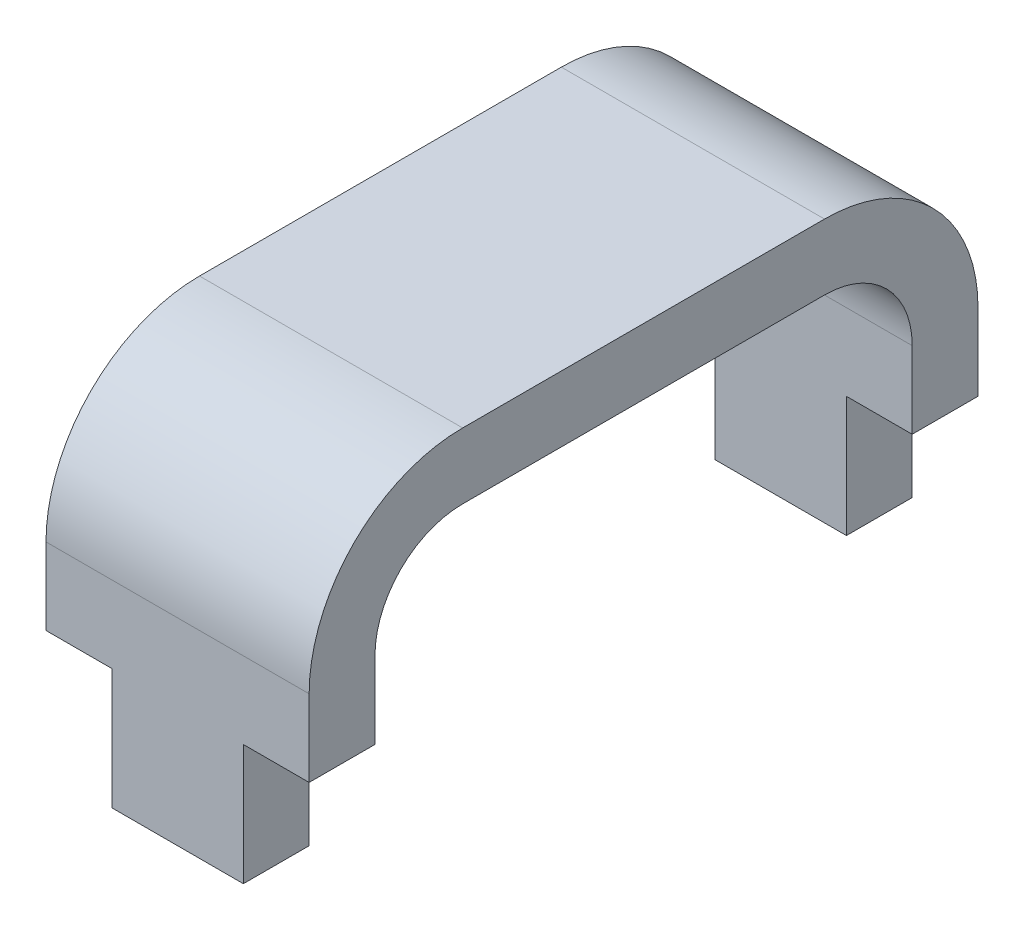
ISO-10303-21;
HEADER;
FILE_DESCRIPTION(('STEP AP214'),'2;1');
FILE_NAME('part.step','',(''),(''),'','','');
FILE_SCHEMA(('AUTOMOTIVE_DESIGN { 1 0 10303 214 1 1 1 1 }'));
ENDSEC;
DATA;
#1=APPLICATION_CONTEXT('core data for automotive mechanical design processes');
#2=APPLICATION_PROTOCOL_DEFINITION('international standard','automotive_design',2000,#1);
#3=PRODUCT_CONTEXT('',#1,'mechanical');
#4=PRODUCT('Part','Part','',(#3));
#5=PRODUCT_RELATED_PRODUCT_CATEGORY('part','',(#4));
#6=PRODUCT_DEFINITION_FORMATION('','',#4);
#7=PRODUCT_DEFINITION_CONTEXT('part definition',#1,'design');
#8=PRODUCT_DEFINITION('design','',#6,#7);
#9=PRODUCT_DEFINITION_SHAPE('','',#8);
#10=(LENGTH_UNIT() NAMED_UNIT(*) SI_UNIT(.MILLI.,.METRE.));
#11=(NAMED_UNIT(*) PLANE_ANGLE_UNIT() SI_UNIT($,.RADIAN.));
#12=(NAMED_UNIT(*) SI_UNIT($,.STERADIAN.) SOLID_ANGLE_UNIT());
#13=UNCERTAINTY_MEASURE_WITH_UNIT(LENGTH_MEASURE(1.E-05),#10,'distance_accuracy_value','');
#14=(GEOMETRIC_REPRESENTATION_CONTEXT(3) GLOBAL_UNCERTAINTY_ASSIGNED_CONTEXT((#13)) GLOBAL_UNIT_ASSIGNED_CONTEXT((#10,
#11,#12)) REPRESENTATION_CONTEXT('',''));
#15=CARTESIAN_POINT('',(0.,0.,0.));
#16=DIRECTION('',(0.,0.,1.));
#17=DIRECTION('',(1.,0.,0.));
#18=AXIS2_PLACEMENT_3D('',#15,#16,#17);
#19=CARTESIAN_POINT('',(12.,-12.5995989304813,-11.1898395721925));
#20=DIRECTION('',(0.,1.,0.));
#21=DIRECTION('',(0.,0.,1.));
#22=AXIS2_PLACEMENT_3D('',#19,#20,#21);
#23=PLANE('',#22);
#24=DIRECTION('',(-1.,0.,0.));
#25=VECTOR('',#24,1.);
#26=CARTESIAN_POINT('',(12.,-12.5995989304813,-11.1898395721925));
#27=LINE('',#26,#25);
#28=CARTESIAN_POINT('',(9.,-12.5995989304813,-11.1898395721925));
#29=VERTEX_POINT('',#28);
#30=CARTESIAN_POINT('',(3.,-12.5995989304813,-11.1898395721925));
#31=VERTEX_POINT('',#30);
#32=EDGE_CURVE('E254',#29,#31,#27,.T.);
#33=ORIENTED_EDGE('',*,*,#32,.T.);
#34=DIRECTION('',(0.,0.,1.));
#35=VECTOR('',#34,1.);
#36=CARTESIAN_POINT('',(3.,-12.5995989304813,-35.6898395721925));
#37=LINE('',#36,#35);
#38=CARTESIAN_POINT('',(3.,-12.5995989304813,-14.1898395721925));
#39=VERTEX_POINT('',#38);
#40=EDGE_CURVE('E192',#39,#31,#37,.T.);
#41=ORIENTED_EDGE('',*,*,#40,.F.);
#42=DIRECTION('',(-1.,0.,0.));
#43=VECTOR('',#42,1.);
#44=CARTESIAN_POINT('',(12.,-12.5995989304813,-14.1898395721925));
#45=LINE('',#44,#43);
#46=CARTESIAN_POINT('',(9.,-12.5995989304813,-14.1898395721925));
#47=VERTEX_POINT('',#46);
#48=EDGE_CURVE('E224',#47,#39,#45,.T.);
#49=ORIENTED_EDGE('',*,*,#48,.F.);
#50=DIRECTION('',(0.,0.,1.));
#51=VECTOR('',#50,1.);
#52=CARTESIAN_POINT('',(9.,-12.5995989304813,-35.6898395721925));
#53=LINE('',#52,#51);
#54=EDGE_CURVE('E363',#47,#29,#53,.T.);
#55=ORIENTED_EDGE('',*,*,#54,.T.);
#56=EDGE_LOOP('',(#33,#41,#49,#55));
#57=FACE_BOUND('',#56,.T.);
#58=ADVANCED_FACE('F42',(#57),#23,.F.);
#59=CARTESIAN_POINT('',(12.,-3.59959893048129,-14.1898395721925));
#60=DIRECTION('',(0.,0.,1.));
#61=DIRECTION('',(1.,0.,0.));
#62=AXIS2_PLACEMENT_3D('',#59,#60,#61);
#63=PLANE('',#62);
#64=DIRECTION('',(0.,1.,0.));
#65=VECTOR('',#64,1.);
#66=CARTESIAN_POINT('',(3.,-3.59959893048129,-14.1898395721925));
#67=LINE('',#66,#65);
#68=CARTESIAN_POINT('',(3.,-7.09959893048129,-14.1898395721925));
#69=VERTEX_POINT('',#68);
#70=EDGE_CURVE('E266',#39,#69,#67,.T.);
#71=ORIENTED_EDGE('',*,*,#70,.T.);
#72=DIRECTION('',(-1.,0.,0.));
#73=VECTOR('',#72,1.);
#74=CARTESIAN_POINT('',(12.,-7.09959893048129,-14.1898395721925));
#75=LINE('',#74,#73);
#76=CARTESIAN_POINT('',(0.,-7.09959893048129,-14.1898395721925));
#77=VERTEX_POINT('',#76);
#78=EDGE_CURVE('E248',#69,#77,#75,.T.);
#79=ORIENTED_EDGE('',*,*,#78,.T.);
#80=DIRECTION('',(0.,1.,0.));
#81=VECTOR('',#80,1.);
#82=CARTESIAN_POINT('',(0.,-3.59959893048129,-14.1898395721925));
#83=LINE('',#82,#81);
#84=CARTESIAN_POINT('',(0.,-3.59959893048129,-14.1898395721925));
#85=VERTEX_POINT('',#84);
#86=EDGE_CURVE('E263',#77,#85,#83,.T.);
#87=ORIENTED_EDGE('',*,*,#86,.T.);
#88=DIRECTION('',(-1.,0.,0.));
#89=VECTOR('',#88,1.);
#90=CARTESIAN_POINT('',(12.,-3.59959893048129,-14.1898395721925));
#91=LINE('',#90,#89);
#92=CARTESIAN_POINT('',(12.,-3.59959893048129,-14.1898395721925));
#93=VERTEX_POINT('',#92);
#94=EDGE_CURVE('E221',#93,#85,#91,.T.);
#95=ORIENTED_EDGE('',*,*,#94,.F.);
#96=DIRECTION('',(0.,1.,0.));
#97=VECTOR('',#96,1.);
#98=CARTESIAN_POINT('',(12.,-3.59959893048129,-14.1898395721925));
#99=LINE('',#98,#97);
#100=CARTESIAN_POINT('',(12.,-7.09959893048128,-14.1898395721925));
#101=VERTEX_POINT('',#100);
#102=EDGE_CURVE('E283',#101,#93,#99,.T.);
#103=ORIENTED_EDGE('',*,*,#102,.F.);
#104=DIRECTION('',(-1.,0.,0.));
#105=VECTOR('',#104,1.);
#106=CARTESIAN_POINT('',(12.,-7.09959893048128,-14.1898395721925));
#107=LINE('',#106,#105);
#108=CARTESIAN_POINT('',(9.,-7.09959893048129,-14.1898395721925));
#109=VERTEX_POINT('',#108);
#110=EDGE_CURVE('E64',#101,#109,#107,.T.);
#111=ORIENTED_EDGE('',*,*,#110,.T.);
#112=DIRECTION('',(0.,-1.,0.));
#113=VECTOR('',#112,1.);
#114=CARTESIAN_POINT('',(9.,-3.59959893048129,-14.1898395721925));
#115=LINE('',#114,#113);
#116=EDGE_CURVE('E338',#109,#47,#115,.T.);
#117=ORIENTED_EDGE('',*,*,#116,.T.);
#118=ORIENTED_EDGE('',*,*,#48,.T.);
#119=EDGE_LOOP('',(#71,#79,#87,#95,#103,#111,#117,#118));
#120=FACE_BOUND('',#119,.T.);
#121=ADVANCED_FACE('F325',(#120),#63,.F.);
#122=CARTESIAN_POINT('',(12.,-3.59959893048128,-7.18983957219251));
#123=DIRECTION('',(-1.,0.,0.));
#124=DIRECTION('',(0.,0.,1.));
#125=AXIS2_PLACEMENT_3D('',#122,#123,#124);
#126=CYLINDRICAL_SURFACE('',#125,7.);
#127=CARTESIAN_POINT('',(0.,-3.59959893048128,-7.18983957219251));
#128=DIRECTION('',(1.,0.,0.));
#129=DIRECTION('',(0.,0.,-1.));
#130=AXIS2_PLACEMENT_3D('',#127,#128,#129);
#131=CIRCLE('',#130,7.);
#132=CARTESIAN_POINT('',(0.,3.40040106951872,-7.18983957219251));
#133=VERTEX_POINT('',#132);
#134=EDGE_CURVE('E265',#85,#133,#131,.T.);
#135=ORIENTED_EDGE('',*,*,#134,.T.);
#136=DIRECTION('',(-1.,0.,0.));
#137=VECTOR('',#136,1.);
#138=CARTESIAN_POINT('',(12.,3.40040106951872,-7.18983957219251));
#139=LINE('',#138,#137);
#140=CARTESIAN_POINT('',(12.,3.40040106951872,-7.18983957219251));
#141=VERTEX_POINT('',#140);
#142=EDGE_CURVE('E218',#141,#133,#139,.T.);
#143=ORIENTED_EDGE('',*,*,#142,.F.);
#144=CARTESIAN_POINT('',(12.,-3.59959893048128,-7.18983957219251));
#145=DIRECTION('',(1.,0.,0.));
#146=DIRECTION('',(0.,0.,-1.));
#147=AXIS2_PLACEMENT_3D('',#144,#145,#146);
#148=CIRCLE('',#147,7.);
#149=EDGE_CURVE('E344',#93,#141,#148,.T.);
#150=ORIENTED_EDGE('',*,*,#149,.F.);
#151=ORIENTED_EDGE('',*,*,#94,.T.);
#152=EDGE_LOOP('',(#135,#143,#150,#151));
#153=FACE_BOUND('',#152,.T.);
#154=ADVANCED_FACE('F391',(#153),#126,.T.);
#155=CARTESIAN_POINT('',(12.,3.40040106951871,9.31016042780749));
#156=DIRECTION('',(0.,-1.,0.));
#157=DIRECTION('',(0.,0.,-1.));
#158=AXIS2_PLACEMENT_3D('',#155,#156,#157);
#159=PLANE('',#158);
#160=DIRECTION('',(0.,0.,1.));
#161=VECTOR('',#160,1.);
#162=CARTESIAN_POINT('',(0.,3.40040106951871,9.31016042780749));
#163=LINE('',#162,#161);
#164=CARTESIAN_POINT('',(0.,3.40040106951871,9.31016042780749));
#165=VERTEX_POINT('',#164);
#166=EDGE_CURVE('E268',#133,#165,#163,.T.);
#167=ORIENTED_EDGE('',*,*,#166,.T.);
#168=DIRECTION('',(-1.,0.,0.));
#169=VECTOR('',#168,1.);
#170=CARTESIAN_POINT('',(12.,3.40040106951871,9.31016042780749));
#171=LINE('',#170,#169);
#172=CARTESIAN_POINT('',(12.,3.40040106951871,9.31016042780749));
#173=VERTEX_POINT('',#172);
#174=EDGE_CURVE('E210',#173,#165,#171,.T.);
#175=ORIENTED_EDGE('',*,*,#174,.F.);
#176=DIRECTION('',(0.,0.,1.));
#177=VECTOR('',#176,1.);
#178=CARTESIAN_POINT('',(12.,3.40040106951871,9.31016042780749));
#179=LINE('',#178,#177);
#180=EDGE_CURVE('E346',#141,#173,#179,.T.);
#181=ORIENTED_EDGE('',*,*,#180,.F.);
#182=ORIENTED_EDGE('',*,*,#142,.T.);
#183=EDGE_LOOP('',(#167,#175,#181,#182));
#184=FACE_BOUND('',#183,.T.);
#185=ADVANCED_FACE('F386',(#184),#159,.F.);
#186=CARTESIAN_POINT('',(12.,-3.59959893048128,9.31016042780749));
#187=DIRECTION('',(-1.,0.,0.));
#188=DIRECTION('',(0.,0.,1.));
#189=AXIS2_PLACEMENT_3D('',#186,#187,#188);
#190=CYLINDRICAL_SURFACE('',#189,7.);
#191=CARTESIAN_POINT('',(0.,-3.59959893048128,9.31016042780749));
#192=DIRECTION('',(1.,0.,0.));
#193=DIRECTION('',(0.,0.,-1.));
#194=AXIS2_PLACEMENT_3D('',#191,#192,#193);
#195=CIRCLE('',#194,7.);
#196=CARTESIAN_POINT('',(0.,-3.59959893048128,16.3101604278075));
#197=VERTEX_POINT('',#196);
#198=EDGE_CURVE('E270',#165,#197,#195,.T.);
#199=ORIENTED_EDGE('',*,*,#198,.T.);
#200=DIRECTION('',(-1.,0.,0.));
#201=VECTOR('',#200,1.);
#202=CARTESIAN_POINT('',(12.,-3.59959893048128,16.3101604278075));
#203=LINE('',#202,#201);
#204=CARTESIAN_POINT('',(12.,-3.59959893048128,16.3101604278075));
#205=VERTEX_POINT('',#204);
#206=EDGE_CURVE('E206',#205,#197,#203,.T.);
#207=ORIENTED_EDGE('',*,*,#206,.F.);
#208=CARTESIAN_POINT('',(12.,-3.59959893048128,9.31016042780749));
#209=DIRECTION('',(1.,0.,0.));
#210=DIRECTION('',(0.,0.,-1.));
#211=AXIS2_PLACEMENT_3D('',#208,#209,#210);
#212=CIRCLE('',#211,7.);
#213=EDGE_CURVE('E348',#173,#205,#212,.T.);
#214=ORIENTED_EDGE('',*,*,#213,.F.);
#215=ORIENTED_EDGE('',*,*,#174,.T.);
#216=EDGE_LOOP('',(#199,#207,#214,#215));
#217=FACE_BOUND('',#216,.T.);
#218=ADVANCED_FACE('F382',(#217),#190,.T.);
#219=CARTESIAN_POINT('',(12.,-3.59959893048129,16.3101604278075));
#220=DIRECTION('',(0.,0.,-1.));
#221=DIRECTION('',(0.,1.,0.));
#222=AXIS2_PLACEMENT_3D('',#219,#220,#221);
#223=PLANE('',#222);
#224=DIRECTION('',(0.,-1.,0.));
#225=VECTOR('',#224,1.);
#226=CARTESIAN_POINT('',(0.,-3.59959893048129,16.3101604278075));
#227=LINE('',#226,#225);
#228=CARTESIAN_POINT('',(0.,-7.09959893048129,16.3101604278075));
#229=VERTEX_POINT('',#228);
#230=EDGE_CURVE('E272',#197,#229,#227,.T.);
#231=ORIENTED_EDGE('',*,*,#230,.T.);
#232=DIRECTION('',(-1.,0.,0.));
#233=VECTOR('',#232,1.);
#234=CARTESIAN_POINT('',(0.,-7.09959893048129,16.3101604278075));
#235=LINE('',#234,#233);
#236=CARTESIAN_POINT('',(3.,-7.09959893048129,16.3101604278075));
#237=VERTEX_POINT('',#236);
#238=EDGE_CURVE('E193',#237,#229,#235,.T.);
#239=ORIENTED_EDGE('',*,*,#238,.F.);
#240=DIRECTION('',(0.,1.,0.));
#241=VECTOR('',#240,1.);
#242=CARTESIAN_POINT('',(3.,-12.5995989304813,16.3101604278075));
#243=LINE('',#242,#241);
#244=CARTESIAN_POINT('',(3.,-12.5995989304813,16.3101604278075));
#245=VERTEX_POINT('',#244);
#246=EDGE_CURVE('E184',#245,#237,#243,.T.);
#247=ORIENTED_EDGE('',*,*,#246,.F.);
#248=DIRECTION('',(-1.,0.,0.));
#249=VECTOR('',#248,1.);
#250=CARTESIAN_POINT('',(12.,-12.5995989304813,16.3101604278075));
#251=LINE('',#250,#249);
#252=CARTESIAN_POINT('',(9.,-12.5995989304813,16.3101604278075));
#253=VERTEX_POINT('',#252);
#254=EDGE_CURVE('E200',#253,#245,#251,.T.);
#255=ORIENTED_EDGE('',*,*,#254,.F.);
#256=DIRECTION('',(0.,-1.,0.));
#257=VECTOR('',#256,1.);
#258=CARTESIAN_POINT('',(9.,-12.5995989304813,16.3101604278075));
#259=LINE('',#258,#257);
#260=CARTESIAN_POINT('',(9.,-7.09959893048129,16.3101604278075));
#261=VERTEX_POINT('',#260);
#262=EDGE_CURVE('E365',#261,#253,#259,.T.);
#263=ORIENTED_EDGE('',*,*,#262,.F.);
#264=DIRECTION('',(-1.,0.,0.));
#265=VECTOR('',#264,1.);
#266=CARTESIAN_POINT('',(12.,-7.09959893048128,16.3101604278075));
#267=LINE('',#266,#265);
#268=CARTESIAN_POINT('',(12.,-7.09959893048128,16.3101604278075));
#269=VERTEX_POINT('',#268);
#270=EDGE_CURVE('E201',#269,#261,#267,.T.);
#271=ORIENTED_EDGE('',*,*,#270,.F.);
#272=DIRECTION('',(0.,-1.,0.));
#273=VECTOR('',#272,1.);
#274=CARTESIAN_POINT('',(12.,-3.59959893048129,16.3101604278075));
#275=LINE('',#274,#273);
#276=EDGE_CURVE('E350',#205,#269,#275,.T.);
#277=ORIENTED_EDGE('',*,*,#276,.F.);
#278=ORIENTED_EDGE('',*,*,#206,.T.);
#279=EDGE_LOOP('',(#231,#239,#247,#255,#263,#271,#277,#278));
#280=FACE_BOUND('',#279,.T.);
#281=ADVANCED_FACE('F198',(#280),#223,.F.);
#282=CARTESIAN_POINT('',(12.,-12.5995989304813,16.3101604278075));
#283=DIRECTION('',(0.,1.,0.));
#284=DIRECTION('',(0.,0.,1.));
#285=AXIS2_PLACEMENT_3D('',#282,#283,#284);
#286=PLANE('',#285);
#287=ORIENTED_EDGE('',*,*,#254,.T.);
#288=CARTESIAN_POINT('',(3.,-12.5995989304813,13.3101604278075));
#289=VERTEX_POINT('',#288);
#290=EDGE_CURVE('E180',#289,#245,#37,.T.);
#291=ORIENTED_EDGE('',*,*,#290,.F.);
#292=DIRECTION('',(-1.,0.,0.));
#293=VECTOR('',#292,1.);
#294=CARTESIAN_POINT('',(12.,-12.5995989304813,13.3101604278075));
#295=LINE('',#294,#293);
#296=CARTESIAN_POINT('',(9.,-12.5995989304813,13.3101604278075));
#297=VERTEX_POINT('',#296);
#298=EDGE_CURVE('E207',#297,#289,#295,.T.);
#299=ORIENTED_EDGE('',*,*,#298,.F.);
#300=EDGE_CURVE('E205',#297,#253,#53,.T.);
#301=ORIENTED_EDGE('',*,*,#300,.T.);
#302=EDGE_LOOP('',(#287,#291,#299,#301));
#303=FACE_BOUND('',#302,.T.);
#304=ADVANCED_FACE('F204',(#303),#286,.F.);
#305=CARTESIAN_POINT('',(12.,-12.5995989304813,13.3101604278075));
#306=DIRECTION('',(0.,0.,1.));
#307=DIRECTION('',(0.,-1.,0.));
#308=AXIS2_PLACEMENT_3D('',#305,#306,#307);
#309=PLANE('',#308);
#310=DIRECTION('',(0.,1.,0.));
#311=VECTOR('',#310,1.);
#312=CARTESIAN_POINT('',(3.,-12.5995989304813,13.3101604278075));
#313=LINE('',#312,#311);
#314=CARTESIAN_POINT('',(3.,-7.09959893048129,13.3101604278075));
#315=VERTEX_POINT('',#314);
#316=EDGE_CURVE('E187',#289,#315,#313,.T.);
#317=ORIENTED_EDGE('',*,*,#316,.T.);
#318=DIRECTION('',(-1.,0.,0.));
#319=VECTOR('',#318,1.);
#320=CARTESIAN_POINT('',(12.,-7.09959893048129,13.3101604278075));
#321=LINE('',#320,#319);
#322=CARTESIAN_POINT('',(0.,-7.09959893048129,13.3101604278075));
#323=VERTEX_POINT('',#322);
#324=EDGE_CURVE('E327',#315,#323,#321,.T.);
#325=ORIENTED_EDGE('',*,*,#324,.T.);
#326=DIRECTION('',(0.,1.,0.));
#327=VECTOR('',#326,1.);
#328=CARTESIAN_POINT('',(0.,-12.5995989304813,13.3101604278075));
#329=LINE('',#328,#327);
#330=CARTESIAN_POINT('',(0.,-3.59959893048128,13.3101604278075));
#331=VERTEX_POINT('',#330);
#332=EDGE_CURVE('E274',#323,#331,#329,.T.);
#333=ORIENTED_EDGE('',*,*,#332,.T.);
#334=DIRECTION('',(-1.,0.,0.));
#335=VECTOR('',#334,1.);
#336=CARTESIAN_POINT('',(12.,-3.59959893048128,13.3101604278075));
#337=LINE('',#336,#335);
#338=CARTESIAN_POINT('',(12.,-3.59959893048128,13.3101604278075));
#339=VERTEX_POINT('',#338);
#340=EDGE_CURVE('E212',#339,#331,#337,.T.);
#341=ORIENTED_EDGE('',*,*,#340,.F.);
#342=DIRECTION('',(0.,1.,0.));
#343=VECTOR('',#342,1.);
#344=CARTESIAN_POINT('',(12.,-12.5995989304813,13.3101604278075));
#345=LINE('',#344,#343);
#346=CARTESIAN_POINT('',(12.,-7.09959893048128,13.3101604278075));
#347=VERTEX_POINT('',#346);
#348=EDGE_CURVE('E353',#347,#339,#345,.T.);
#349=ORIENTED_EDGE('',*,*,#348,.F.);
#350=DIRECTION('',(-1.,0.,0.));
#351=VECTOR('',#350,1.);
#352=CARTESIAN_POINT('',(12.,-7.09959893048128,13.3101604278075));
#353=LINE('',#352,#351);
#354=CARTESIAN_POINT('',(9.,-7.09959893048129,13.3101604278075));
#355=VERTEX_POINT('',#354);
#356=EDGE_CURVE('E56',#347,#355,#353,.T.);
#357=ORIENTED_EDGE('',*,*,#356,.T.);
#358=DIRECTION('',(0.,-1.,0.));
#359=VECTOR('',#358,1.);
#360=CARTESIAN_POINT('',(9.,-12.5995989304813,13.3101604278075));
#361=LINE('',#360,#359);
#362=EDGE_CURVE('E335',#355,#297,#361,.T.);
#363=ORIENTED_EDGE('',*,*,#362,.T.);
#364=ORIENTED_EDGE('',*,*,#298,.T.);
#365=EDGE_LOOP('',(#317,#325,#333,#341,#349,#357,#363,#364));
#366=FACE_BOUND('',#365,.T.);
#367=ADVANCED_FACE('F355',(#366),#309,.F.);
#368=CARTESIAN_POINT('',(12.,-3.59959893048128,9.31016042780749));
#369=DIRECTION('',(-1.,0.,0.));
#370=DIRECTION('',(0.,0.,1.));
#371=AXIS2_PLACEMENT_3D('',#368,#369,#370);
#372=CYLINDRICAL_SURFACE('',#371,4.);
#373=CARTESIAN_POINT('',(0.,-3.59959893048128,9.31016042780749));
#374=DIRECTION('',(-1.,0.,0.));
#375=DIRECTION('',(0.,0.,-1.));
#376=AXIS2_PLACEMENT_3D('',#373,#374,#375);
#377=CIRCLE('',#376,4.);
#378=CARTESIAN_POINT('',(0.,0.400401069518716,9.31016042780749));
#379=VERTEX_POINT('',#378);
#380=EDGE_CURVE('E276',#331,#379,#377,.T.);
#381=ORIENTED_EDGE('',*,*,#380,.T.);
#382=DIRECTION('',(-1.,0.,0.));
#383=VECTOR('',#382,1.);
#384=CARTESIAN_POINT('',(12.,0.400401069518716,9.31016042780749));
#385=LINE('',#384,#383);
#386=CARTESIAN_POINT('',(12.,0.400401069518716,9.31016042780749));
#387=VERTEX_POINT('',#386);
#388=EDGE_CURVE('E289',#387,#379,#385,.T.);
#389=ORIENTED_EDGE('',*,*,#388,.F.);
#390=CARTESIAN_POINT('',(12.,-3.59959893048128,9.31016042780749));
#391=DIRECTION('',(-1.,0.,0.));
#392=DIRECTION('',(0.,0.,-1.));
#393=AXIS2_PLACEMENT_3D('',#390,#391,#392);
#394=CIRCLE('',#393,4.);
#395=EDGE_CURVE('E298',#339,#387,#394,.T.);
#396=ORIENTED_EDGE('',*,*,#395,.F.);
#397=ORIENTED_EDGE('',*,*,#340,.T.);
#398=EDGE_LOOP('',(#381,#389,#396,#397));
#399=FACE_BOUND('',#398,.T.);
#400=ADVANCED_FACE('F296',(#399),#372,.F.);
#401=CARTESIAN_POINT('',(12.,0.400401069518715,9.31016042780749));
#402=DIRECTION('',(0.,1.,0.));
#403=DIRECTION('',(0.,0.,1.));
#404=AXIS2_PLACEMENT_3D('',#401,#402,#403);
#405=PLANE('',#404);
#406=DIRECTION('',(0.,0.,-1.));
#407=VECTOR('',#406,1.);
#408=CARTESIAN_POINT('',(0.,0.400401069518715,9.31016042780749));
#409=LINE('',#408,#407);
#410=CARTESIAN_POINT('',(0.,0.400401069518715,-7.18983957219251));
#411=VERTEX_POINT('',#410);
#412=EDGE_CURVE('E278',#379,#411,#409,.T.);
#413=ORIENTED_EDGE('',*,*,#412,.T.);
#414=DIRECTION('',(-1.,0.,0.));
#415=VECTOR('',#414,1.);
#416=CARTESIAN_POINT('',(12.,0.400401069518715,-7.18983957219251));
#417=LINE('',#416,#415);
#418=CARTESIAN_POINT('',(12.,0.400401069518715,-7.18983957219251));
#419=VERTEX_POINT('',#418);
#420=EDGE_CURVE('E286',#419,#411,#417,.T.);
#421=ORIENTED_EDGE('',*,*,#420,.F.);
#422=DIRECTION('',(0.,0.,-1.));
#423=VECTOR('',#422,1.);
#424=CARTESIAN_POINT('',(12.,0.400401069518715,9.31016042780749));
#425=LINE('',#424,#423);
#426=EDGE_CURVE('E259',#387,#419,#425,.T.);
#427=ORIENTED_EDGE('',*,*,#426,.F.);
#428=ORIENTED_EDGE('',*,*,#388,.T.);
#429=EDGE_LOOP('',(#413,#421,#427,#428));
#430=FACE_BOUND('',#429,.T.);
#431=ADVANCED_FACE('F310',(#430),#405,.F.);
#432=CARTESIAN_POINT('',(12.,-3.59959893048128,-7.18983957219251));
#433=DIRECTION('',(-1.,0.,0.));
#434=DIRECTION('',(0.,0.,1.));
#435=AXIS2_PLACEMENT_3D('',#432,#433,#434);
#436=CYLINDRICAL_SURFACE('',#435,4.);
#437=CARTESIAN_POINT('',(0.,-3.59959893048128,-7.18983957219251));
#438=DIRECTION('',(-1.,0.,0.));
#439=DIRECTION('',(0.,0.,-1.));
#440=AXIS2_PLACEMENT_3D('',#437,#438,#439);
#441=CIRCLE('',#440,4.);
#442=CARTESIAN_POINT('',(0.,-3.59959893048128,-11.1898395721925));
#443=VERTEX_POINT('',#442);
#444=EDGE_CURVE('E280',#411,#443,#441,.T.);
#445=ORIENTED_EDGE('',*,*,#444,.T.);
#446=DIRECTION('',(-1.,0.,0.));
#447=VECTOR('',#446,1.);
#448=CARTESIAN_POINT('',(12.,-3.59959893048128,-11.1898395721925));
#449=LINE('',#448,#447);
#450=CARTESIAN_POINT('',(12.,-3.59959893048128,-11.1898395721925));
#451=VERTEX_POINT('',#450);
#452=EDGE_CURVE('E257',#451,#443,#449,.T.);
#453=ORIENTED_EDGE('',*,*,#452,.F.);
#454=CARTESIAN_POINT('',(12.,-3.59959893048128,-7.18983957219251));
#455=DIRECTION('',(-1.,0.,0.));
#456=DIRECTION('',(0.,0.,-1.));
#457=AXIS2_PLACEMENT_3D('',#454,#455,#456);
#458=CIRCLE('',#457,4.);
#459=EDGE_CURVE('E252',#419,#451,#458,.T.);
#460=ORIENTED_EDGE('',*,*,#459,.F.);
#461=ORIENTED_EDGE('',*,*,#420,.T.);
#462=EDGE_LOOP('',(#445,#453,#460,#461));
#463=FACE_BOUND('',#462,.T.);
#464=ADVANCED_FACE('F313',(#463),#436,.F.);
#465=CARTESIAN_POINT('',(12.,-3.59959893048128,-11.1898395721925));
#466=DIRECTION('',(0.,0.,-1.));
#467=DIRECTION('',(0.,1.,0.));
#468=AXIS2_PLACEMENT_3D('',#465,#466,#467);
#469=PLANE('',#468);
#470=DIRECTION('',(0.,-1.,0.));
#471=VECTOR('',#470,1.);
#472=CARTESIAN_POINT('',(0.,-3.59959893048128,-11.1898395721925));
#473=LINE('',#472,#471);
#474=CARTESIAN_POINT('',(0.,-7.09959893048129,-11.1898395721925));
#475=VERTEX_POINT('',#474);
#476=EDGE_CURVE('E282',#443,#475,#473,.T.);
#477=ORIENTED_EDGE('',*,*,#476,.T.);
#478=DIRECTION('',(1.,0.,0.));
#479=VECTOR('',#478,1.);
#480=CARTESIAN_POINT('',(12.,-7.09959893048129,-11.1898395721925));
#481=LINE('',#480,#479);
#482=CARTESIAN_POINT('',(3.,-7.09959893048129,-11.1898395721925));
#483=VERTEX_POINT('',#482);
#484=EDGE_CURVE('E322',#475,#483,#481,.T.);
#485=ORIENTED_EDGE('',*,*,#484,.T.);
#486=DIRECTION('',(0.,-1.,0.));
#487=VECTOR('',#486,1.);
#488=CARTESIAN_POINT('',(3.,-3.59959893048128,-11.1898395721925));
#489=LINE('',#488,#487);
#490=EDGE_CURVE('E11',#483,#31,#489,.T.);
#491=ORIENTED_EDGE('',*,*,#490,.T.);
#492=ORIENTED_EDGE('',*,*,#32,.F.);
#493=DIRECTION('',(0.,1.,0.));
#494=VECTOR('',#493,1.);
#495=CARTESIAN_POINT('',(9.,-3.59959893048128,-11.1898395721925));
#496=LINE('',#495,#494);
#497=CARTESIAN_POINT('',(9.,-7.09959893048129,-11.1898395721925));
#498=VERTEX_POINT('',#497);
#499=EDGE_CURVE('E49',#29,#498,#496,.T.);
#500=ORIENTED_EDGE('',*,*,#499,.T.);
#501=DIRECTION('',(1.,0.,0.));
#502=VECTOR('',#501,1.);
#503=CARTESIAN_POINT('',(12.,-7.09959893048128,-11.1898395721925));
#504=LINE('',#503,#502);
#505=CARTESIAN_POINT('',(12.,-7.09959893048128,-11.1898395721925));
#506=VERTEX_POINT('',#505);
#507=EDGE_CURVE('E238',#498,#506,#504,.T.);
#508=ORIENTED_EDGE('',*,*,#507,.T.);
#509=DIRECTION('',(0.,-1.,0.));
#510=VECTOR('',#509,1.);
#511=CARTESIAN_POINT('',(12.,-3.59959893048128,-11.1898395721925));
#512=LINE('',#511,#510);
#513=EDGE_CURVE('E247',#451,#506,#512,.T.);
#514=ORIENTED_EDGE('',*,*,#513,.F.);
#515=ORIENTED_EDGE('',*,*,#452,.T.);
#516=EDGE_LOOP('',(#477,#485,#491,#492,#500,#508,#514,#515));
#517=FACE_BOUND('',#516,.T.);
#518=ADVANCED_FACE('F245',(#517),#469,.F.);
#519=CARTESIAN_POINT('',(12.,-3.59959893048128,-7.18983957219251));
#520=DIRECTION('',(1.,0.,0.));
#521=DIRECTION('',(0.,0.,-1.));
#522=AXIS2_PLACEMENT_3D('',#519,#520,#521);
#523=PLANE('',#522);
#524=DIRECTION('',(0.,0.,1.));
#525=VECTOR('',#524,1.);
#526=CARTESIAN_POINT('',(12.,-7.09959893048128,-7.18983957219251));
#527=LINE('',#526,#525);
#528=EDGE_CURVE('E232',#101,#506,#527,.T.);
#529=ORIENTED_EDGE('',*,*,#528,.F.);
#530=ORIENTED_EDGE('',*,*,#102,.T.);
#531=ORIENTED_EDGE('',*,*,#149,.T.);
#532=ORIENTED_EDGE('',*,*,#180,.T.);
#533=ORIENTED_EDGE('',*,*,#213,.T.);
#534=ORIENTED_EDGE('',*,*,#276,.T.);
#535=EDGE_CURVE('E231',#347,#269,#527,.T.);
#536=ORIENTED_EDGE('',*,*,#535,.F.);
#537=ORIENTED_EDGE('',*,*,#348,.T.);
#538=ORIENTED_EDGE('',*,*,#395,.T.);
#539=ORIENTED_EDGE('',*,*,#426,.T.);
#540=ORIENTED_EDGE('',*,*,#459,.T.);
#541=ORIENTED_EDGE('',*,*,#513,.T.);
#542=EDGE_LOOP('',(#529,#530,#531,#532,#533,#534,#536,#537,#538,#539,#540,#541));
#543=FACE_BOUND('',#542,.T.);
#544=ADVANCED_FACE('F250',(#543),#523,.T.);
#545=CARTESIAN_POINT('',(0.,-3.59959893048128,-7.18983957219251));
#546=DIRECTION('',(1.,0.,0.));
#547=DIRECTION('',(0.,0.,-1.));
#548=AXIS2_PLACEMENT_3D('',#545,#546,#547);
#549=PLANE('',#548);
#550=ORIENTED_EDGE('',*,*,#86,.F.);
#551=DIRECTION('',(0.,0.,1.));
#552=VECTOR('',#551,1.);
#553=CARTESIAN_POINT('',(0.,-7.09959893048129,-7.18983957219251));
#554=LINE('',#553,#552);
#555=EDGE_CURVE('E230',#77,#475,#554,.T.);
#556=ORIENTED_EDGE('',*,*,#555,.T.);
#557=ORIENTED_EDGE('',*,*,#476,.F.);
#558=ORIENTED_EDGE('',*,*,#444,.F.);
#559=ORIENTED_EDGE('',*,*,#412,.F.);
#560=ORIENTED_EDGE('',*,*,#380,.F.);
#561=ORIENTED_EDGE('',*,*,#332,.F.);
#562=EDGE_CURVE('E227',#323,#229,#554,.T.);
#563=ORIENTED_EDGE('',*,*,#562,.T.);
#564=ORIENTED_EDGE('',*,*,#230,.F.);
#565=ORIENTED_EDGE('',*,*,#198,.F.);
#566=ORIENTED_EDGE('',*,*,#166,.F.);
#567=ORIENTED_EDGE('',*,*,#134,.F.);
#568=EDGE_LOOP('',(#550,#556,#557,#558,#559,#560,#561,#563,#564,#565,#566,#567));
#569=FACE_BOUND('',#568,.T.);
#570=ADVANCED_FACE('F305',(#569),#549,.F.);
#571=CARTESIAN_POINT('',(0.,-7.09959893048129,-35.6898395721925));
#572=DIRECTION('',(0.,1.,0.));
#573=DIRECTION('',(0.,0.,1.));
#574=AXIS2_PLACEMENT_3D('',#571,#572,#573);
#575=PLANE('',#574);
#576=DIRECTION('',(0.,0.,1.));
#577=VECTOR('',#576,1.);
#578=CARTESIAN_POINT('',(3.,-7.09959893048129,-35.6898395721925));
#579=LINE('',#578,#577);
#580=EDGE_CURVE('E372',#315,#237,#579,.T.);
#581=ORIENTED_EDGE('',*,*,#580,.T.);
#582=ORIENTED_EDGE('',*,*,#238,.T.);
#583=ORIENTED_EDGE('',*,*,#562,.F.);
#584=ORIENTED_EDGE('',*,*,#324,.F.);
#585=EDGE_LOOP('',(#581,#582,#583,#584));
#586=FACE_BOUND('',#585,.T.);
#587=ADVANCED_FACE('F375',(#586),#575,.F.);
#588=CARTESIAN_POINT('',(3.,-12.5995989304813,-35.6898395721925));
#589=DIRECTION('',(1.,0.,0.));
#590=DIRECTION('',(0.,0.,-1.));
#591=AXIS2_PLACEMENT_3D('',#588,#589,#590);
#592=PLANE('',#591);
#593=ORIENTED_EDGE('',*,*,#290,.T.);
#594=ORIENTED_EDGE('',*,*,#246,.T.);
#595=ORIENTED_EDGE('',*,*,#580,.F.);
#596=ORIENTED_EDGE('',*,*,#316,.F.);
#597=EDGE_LOOP('',(#593,#594,#595,#596));
#598=FACE_BOUND('',#597,.T.);
#599=ADVANCED_FACE('F182',(#598),#592,.F.);
#600=ORIENTED_EDGE('',*,*,#40,.T.);
#601=ORIENTED_EDGE('',*,*,#490,.F.);
#602=EDGE_CURVE('E371',#69,#483,#579,.T.);
#603=ORIENTED_EDGE('',*,*,#602,.F.);
#604=ORIENTED_EDGE('',*,*,#70,.F.);
#605=EDGE_LOOP('',(#600,#601,#603,#604));
#606=FACE_BOUND('',#605,.T.);
#607=ADVANCED_FACE('F397',(#606),#592,.F.);
#608=ORIENTED_EDGE('',*,*,#602,.T.);
#609=ORIENTED_EDGE('',*,*,#484,.F.);
#610=ORIENTED_EDGE('',*,*,#555,.F.);
#611=ORIENTED_EDGE('',*,*,#78,.F.);
#612=EDGE_LOOP('',(#608,#609,#610,#611));
#613=FACE_BOUND('',#612,.T.);
#614=ADVANCED_FACE('F320',(#613),#575,.F.);
#615=CARTESIAN_POINT('',(12.,-7.09959893048128,-35.6898395721925));
#616=DIRECTION('',(0.,1.,0.));
#617=DIRECTION('',(-1.,0.,0.));
#618=AXIS2_PLACEMENT_3D('',#615,#616,#617);
#619=PLANE('',#618);
#620=ORIENTED_EDGE('',*,*,#535,.T.);
#621=ORIENTED_EDGE('',*,*,#270,.T.);
#622=DIRECTION('',(0.,0.,1.));
#623=VECTOR('',#622,1.);
#624=CARTESIAN_POINT('',(9.,-7.09959893048129,-35.6898395721925));
#625=LINE('',#624,#623);
#626=EDGE_CURVE('E358',#355,#261,#625,.T.);
#627=ORIENTED_EDGE('',*,*,#626,.F.);
#628=ORIENTED_EDGE('',*,*,#356,.F.);
#629=EDGE_LOOP('',(#620,#621,#627,#628));
#630=FACE_BOUND('',#629,.T.);
#631=ADVANCED_FACE('F360',(#630),#619,.F.);
#632=CARTESIAN_POINT('',(9.,-12.5995989304813,-35.6898395721925));
#633=DIRECTION('',(-1.,0.,0.));
#634=DIRECTION('',(0.,0.,1.));
#635=AXIS2_PLACEMENT_3D('',#632,#633,#634);
#636=PLANE('',#635);
#637=ORIENTED_EDGE('',*,*,#626,.T.);
#638=ORIENTED_EDGE('',*,*,#262,.T.);
#639=ORIENTED_EDGE('',*,*,#300,.F.);
#640=ORIENTED_EDGE('',*,*,#362,.F.);
#641=EDGE_LOOP('',(#637,#638,#639,#640));
#642=FACE_BOUND('',#641,.T.);
#643=ADVANCED_FACE('F357',(#642),#636,.F.);
#644=EDGE_CURVE('E362',#109,#498,#625,.T.);
#645=ORIENTED_EDGE('',*,*,#644,.T.);
#646=ORIENTED_EDGE('',*,*,#499,.F.);
#647=ORIENTED_EDGE('',*,*,#54,.F.);
#648=ORIENTED_EDGE('',*,*,#116,.F.);
#649=EDGE_LOOP('',(#645,#646,#647,#648));
#650=FACE_BOUND('',#649,.T.);
#651=ADVANCED_FACE('F437',(#650),#636,.F.);
#652=ORIENTED_EDGE('',*,*,#528,.T.);
#653=ORIENTED_EDGE('',*,*,#507,.F.);
#654=ORIENTED_EDGE('',*,*,#644,.F.);
#655=ORIENTED_EDGE('',*,*,#110,.F.);
#656=EDGE_LOOP('',(#652,#653,#654,#655));
#657=FACE_BOUND('',#656,.T.);
#658=ADVANCED_FACE('F237',(#657),#619,.F.);
#659=CLOSED_SHELL('',(#58,#121,#154,#185,#218,#281,#304,#367,#400,#431,#464,#518,#544,#570,#587,
#599,#607,#614,#631,#643,#651,#658));
#660=MANIFOLD_SOLID_BREP('B2',#659);
#661=ADVANCED_BREP_SHAPE_REPRESENTATION('',(#18,#660),#14);
#662=SHAPE_DEFINITION_REPRESENTATION(#9,#661);
ENDSEC;
END-ISO-10303-21;
